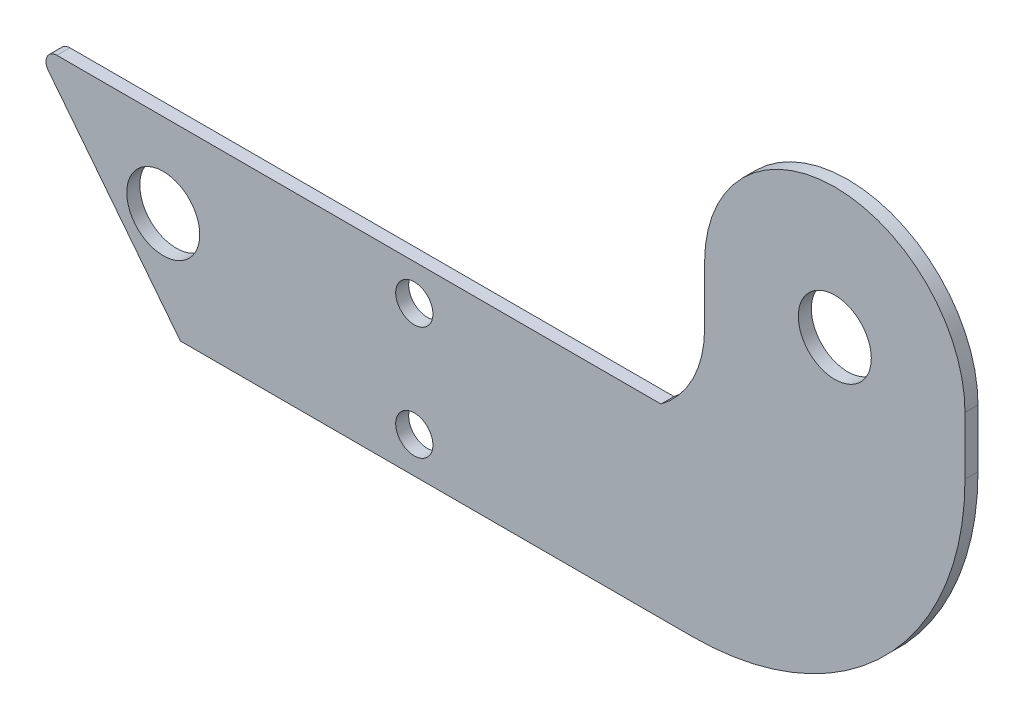
ISO-10303-21;
HEADER;
FILE_DESCRIPTION(('STEP AP214'),'2;1');
FILE_NAME('part.step','',(''),(''),'','','');
FILE_SCHEMA(('AUTOMOTIVE_DESIGN { 1 0 10303 214 1 1 1 1 }'));
ENDSEC;
DATA;
#1=APPLICATION_CONTEXT('core data for automotive mechanical design processes');
#2=APPLICATION_PROTOCOL_DEFINITION('international standard','automotive_design',2000,#1);
#3=PRODUCT_CONTEXT('',#1,'mechanical');
#4=PRODUCT('Part','Part','',(#3));
#5=PRODUCT_RELATED_PRODUCT_CATEGORY('part','',(#4));
#6=PRODUCT_DEFINITION_FORMATION('','',#4);
#7=PRODUCT_DEFINITION_CONTEXT('part definition',#1,'design');
#8=PRODUCT_DEFINITION('design','',#6,#7);
#9=PRODUCT_DEFINITION_SHAPE('','',#8);
#10=(LENGTH_UNIT() NAMED_UNIT(*) SI_UNIT(.MILLI.,.METRE.));
#11=(NAMED_UNIT(*) PLANE_ANGLE_UNIT() SI_UNIT($,.RADIAN.));
#12=(NAMED_UNIT(*) SI_UNIT($,.STERADIAN.) SOLID_ANGLE_UNIT());
#13=UNCERTAINTY_MEASURE_WITH_UNIT(LENGTH_MEASURE(1.E-05),#10,'distance_accuracy_value','');
#14=(GEOMETRIC_REPRESENTATION_CONTEXT(3) GLOBAL_UNCERTAINTY_ASSIGNED_CONTEXT((#13)) GLOBAL_UNIT_ASSIGNED_CONTEXT((#10,
#11,#12)) REPRESENTATION_CONTEXT('',''));
#15=CARTESIAN_POINT('',(0.,0.,0.));
#16=DIRECTION('',(0.,0.,1.));
#17=DIRECTION('',(1.,0.,0.));
#18=AXIS2_PLACEMENT_3D('',#15,#16,#17);
#19=CARTESIAN_POINT('',(0.,0.,1.8));
#20=DIRECTION('',(0.,0.,1.));
#21=DIRECTION('',(1.,0.,0.));
#22=AXIS2_PLACEMENT_3D('',#19,#20,#21);
#23=PLANE('',#22);
#24=CARTESIAN_POINT('',(-58.1953348882656,-25.0276954441722,1.8));
#25=DIRECTION('',(0.,0.,1.));
#26=DIRECTION('',(1.,0.,0.));
#27=AXIS2_PLACEMENT_3D('',#24,#25,#26);
#28=CIRCLE('',#27,2.57408060153384);
#29=CARTESIAN_POINT('',(-55.6212542867317,-25.0276954441722,1.8));
#30=VERTEX_POINT('',#29);
#31=EDGE_CURVE('E220',#30,#30,#28,.T.);
#32=ORIENTED_EDGE('',*,*,#31,.F.);
#33=EDGE_LOOP('',(#32));
#34=FACE_BOUND('',#33,.T.);
#35=CARTESIAN_POINT('',(0.,0.,1.8));
#36=DIRECTION('',(0.,0.,1.));
#37=DIRECTION('',(1.,0.,0.));
#38=AXIS2_PLACEMENT_3D('',#35,#36,#37);
#39=CIRCLE('',#38,5.05);
#40=CARTESIAN_POINT('',(5.05,0.,1.8));
#41=VERTEX_POINT('',#40);
#42=EDGE_CURVE('E191',#41,#41,#39,.T.);
#43=ORIENTED_EDGE('',*,*,#42,.F.);
#44=EDGE_LOOP('',(#43));
#45=FACE_BOUND('',#44,.T.);
#46=DIRECTION('',(-1.,0.,0.));
#47=VECTOR('',#46,1.);
#48=CARTESIAN_POINT('',(-24.0556103281021,-20.0276954441722,1.8));
#49=LINE('',#48,#47);
#50=CARTESIAN_POINT('',(-24.0556103281021,-20.0276954441722,1.8));
#51=VERTEX_POINT('',#50);
#52=CARTESIAN_POINT('',(-107.666374094776,-20.0276954441722,1.8));
#53=VERTEX_POINT('',#52);
#54=EDGE_CURVE('E203',#51,#53,#49,.T.);
#55=ORIENTED_EDGE('',*,*,#54,.T.);
#56=CARTESIAN_POINT('',(-107.666374094776,-21.5276954441722,1.8));
#57=DIRECTION('',(0.,0.,1.));
#58=DIRECTION('',(1.,0.,0.));
#59=AXIS2_PLACEMENT_3D('',#56,#57,#58);
#60=CIRCLE('',#59,1.5);
#61=CARTESIAN_POINT('',(-108.846127301271,-22.4540767758951,1.8));
#62=VERTEX_POINT('',#61);
#63=EDGE_CURVE('E11',#53,#62,#60,.T.);
#64=ORIENTED_EDGE('',*,*,#63,.T.);
#65=DIRECTION('',(0.617587554481916,-0.786502137663367,0.));
#66=VECTOR('',#65,1.);
#67=CARTESIAN_POINT('',(-110.751402368102,-20.0276954441722,1.8));
#68=LINE('',#67,#66);
#69=CARTESIAN_POINT('',(-90.5665985578281,-45.7331864792268,1.8));
#70=VERTEX_POINT('',#69);
#71=EDGE_CURVE('E200',#62,#70,#68,.T.);
#72=ORIENTED_EDGE('',*,*,#71,.T.);
#73=DIRECTION('',(1.,0.,0.));
#74=VECTOR('',#73,1.);
#75=CARTESIAN_POINT('',(-19.7146222684898,-45.7331864792268,1.8));
#76=LINE('',#75,#74);
#77=CARTESIAN_POINT('',(-19.7146222684898,-45.7331864792268,1.8));
#78=VERTEX_POINT('',#77);
#79=EDGE_CURVE('E197',#70,#78,#76,.T.);
#80=ORIENTED_EDGE('',*,*,#79,.T.);
#81=CARTESIAN_POINT('',(-19.7146222684898,-8.,1.8));
#82=DIRECTION('',(0.,0.,1.));
#83=DIRECTION('',(-1.,0.,0.));
#84=AXIS2_PLACEMENT_3D('',#81,#82,#83);
#85=CIRCLE('',#84,37.7331864792268);
#86=CARTESIAN_POINT('',(18.018564210737,-8.,1.8));
#87=VERTEX_POINT('',#86);
#88=EDGE_CURVE('E194',#78,#87,#85,.T.);
#89=ORIENTED_EDGE('',*,*,#88,.T.);
#90=DIRECTION('',(0.,1.,0.));
#91=VECTOR('',#90,1.);
#92=CARTESIAN_POINT('',(18.018564210737,0.,1.8));
#93=LINE('',#92,#91);
#94=CARTESIAN_POINT('',(18.018564210737,0.,1.8));
#95=VERTEX_POINT('',#94);
#96=EDGE_CURVE('E128',#87,#95,#93,.T.);
#97=ORIENTED_EDGE('',*,*,#96,.T.);
#98=CARTESIAN_POINT('',(0.,0.,1.8));
#99=DIRECTION('',(0.,0.,1.));
#100=DIRECTION('',(1.,0.,0.));
#101=AXIS2_PLACEMENT_3D('',#98,#99,#100);
#102=CIRCLE('',#101,18.018564210737);
#103=CARTESIAN_POINT('',(-18.018564210737,0.,1.8));
#104=VERTEX_POINT('',#103);
#105=EDGE_CURVE('E123',#95,#104,#102,.T.);
#106=ORIENTED_EDGE('',*,*,#105,.T.);
#107=DIRECTION('',(0.,-1.,0.));
#108=VECTOR('',#107,1.);
#109=CARTESIAN_POINT('',(-18.018564210737,0.,1.8));
#110=LINE('',#109,#108);
#111=CARTESIAN_POINT('',(-18.018564210737,-8.,1.8));
#112=VERTEX_POINT('',#111);
#113=EDGE_CURVE('E111',#104,#112,#110,.T.);
#114=ORIENTED_EDGE('',*,*,#113,.T.);
#115=CARTESIAN_POINT('',(-33.018564210737,-8.,1.8));
#116=DIRECTION('',(0.,0.,-1.));
#117=DIRECTION('',(-1.,0.,0.));
#118=AXIS2_PLACEMENT_3D('',#115,#116,#117);
#119=CIRCLE('',#118,15.);
#120=EDGE_CURVE('E122',#112,#51,#119,.T.);
#121=ORIENTED_EDGE('',*,*,#120,.T.);
#122=EDGE_LOOP('',(#55,#64,#72,#80,#89,#97,#106,#114,#121));
#123=FACE_BOUND('',#122,.T.);
#124=CARTESIAN_POINT('',(-58.1953348882656,-40.7331864792268,1.8));
#125=DIRECTION('',(0.,0.,1.));
#126=DIRECTION('',(1.,0.,0.));
#127=AXIS2_PLACEMENT_3D('',#124,#125,#126);
#128=CIRCLE('',#127,2.57408060153384);
#129=CARTESIAN_POINT('',(-55.6212542867317,-40.7331864792268,1.8));
#130=VERTEX_POINT('',#129);
#131=EDGE_CURVE('E212',#130,#130,#128,.T.);
#132=ORIENTED_EDGE('',*,*,#131,.F.);
#133=EDGE_LOOP('',(#132));
#134=FACE_BOUND('',#133,.T.);
#135=CARTESIAN_POINT('',(-92.9380100507997,-31.6399946487743,1.8));
#136=DIRECTION('',(0.,0.,1.));
#137=DIRECTION('',(1.,0.,0.));
#138=AXIS2_PLACEMENT_3D('',#135,#136,#137);
#139=CIRCLE('',#138,5.05);
#140=CARTESIAN_POINT('',(-87.8880100507997,-31.6399946487743,1.8));
#141=VERTEX_POINT('',#140);
#142=EDGE_CURVE('E228',#141,#141,#139,.T.);
#143=ORIENTED_EDGE('',*,*,#142,.F.);
#144=EDGE_LOOP('',(#143));
#145=FACE_BOUND('',#144,.T.);
#146=ADVANCED_FACE('F39',(#34,#45,#123,#134,#145),#23,.T.);
#147=CARTESIAN_POINT('',(0.,0.,0.));
#148=DIRECTION('',(0.,0.,1.));
#149=DIRECTION('',(1.,0.,0.));
#150=AXIS2_PLACEMENT_3D('',#147,#148,#149);
#151=PLANE('',#150);
#152=DIRECTION('',(0.617587554481916,-0.786502137663367,0.));
#153=VECTOR('',#152,1.);
#154=CARTESIAN_POINT('',(-110.751402368102,-20.0276954441722,0.));
#155=LINE('',#154,#153);
#156=CARTESIAN_POINT('',(-108.846127301271,-22.4540767758951,0.));
#157=VERTEX_POINT('',#156);
#158=CARTESIAN_POINT('',(-90.5665985578281,-45.7331864792268,0.));
#159=VERTEX_POINT('',#158);
#160=EDGE_CURVE('E177',#157,#159,#155,.T.);
#161=ORIENTED_EDGE('',*,*,#160,.F.);
#162=CARTESIAN_POINT('',(-107.666374094776,-21.5276954441722,0.));
#163=DIRECTION('',(0.,0.,1.));
#164=DIRECTION('',(1.,0.,0.));
#165=AXIS2_PLACEMENT_3D('',#162,#163,#164);
#166=CIRCLE('',#165,1.5);
#167=CARTESIAN_POINT('',(-107.666374094776,-20.0276954441722,0.));
#168=VERTEX_POINT('',#167);
#169=EDGE_CURVE('E62',#157,#168,#166,.F.);
#170=ORIENTED_EDGE('',*,*,#169,.T.);
#171=DIRECTION('',(-1.,0.,0.));
#172=VECTOR('',#171,1.);
#173=CARTESIAN_POINT('',(-24.0556103281021,-20.0276954441722,0.));
#174=LINE('',#173,#172);
#175=CARTESIAN_POINT('',(-24.0556103281021,-20.0276954441722,0.));
#176=VERTEX_POINT('',#175);
#177=EDGE_CURVE('E180',#176,#168,#174,.T.);
#178=ORIENTED_EDGE('',*,*,#177,.F.);
#179=CARTESIAN_POINT('',(-33.018564210737,-8.,0.));
#180=DIRECTION('',(0.,0.,-1.));
#181=DIRECTION('',(-1.,0.,0.));
#182=AXIS2_PLACEMENT_3D('',#179,#180,#181);
#183=CIRCLE('',#182,15.);
#184=CARTESIAN_POINT('',(-18.018564210737,-8.,0.));
#185=VERTEX_POINT('',#184);
#186=EDGE_CURVE('E183',#185,#176,#183,.T.);
#187=ORIENTED_EDGE('',*,*,#186,.F.);
#188=DIRECTION('',(0.,-1.,0.));
#189=VECTOR('',#188,1.);
#190=CARTESIAN_POINT('',(-18.018564210737,0.,0.));
#191=LINE('',#190,#189);
#192=CARTESIAN_POINT('',(-18.018564210737,0.,0.));
#193=VERTEX_POINT('',#192);
#194=EDGE_CURVE('E186',#193,#185,#191,.T.);
#195=ORIENTED_EDGE('',*,*,#194,.F.);
#196=CARTESIAN_POINT('',(0.,0.,0.));
#197=DIRECTION('',(0.,0.,1.));
#198=DIRECTION('',(1.,0.,0.));
#199=AXIS2_PLACEMENT_3D('',#196,#197,#198);
#200=CIRCLE('',#199,18.018564210737);
#201=CARTESIAN_POINT('',(18.018564210737,0.,0.));
#202=VERTEX_POINT('',#201);
#203=EDGE_CURVE('E137',#202,#193,#200,.T.);
#204=ORIENTED_EDGE('',*,*,#203,.F.);
#205=DIRECTION('',(0.,1.,0.));
#206=VECTOR('',#205,1.);
#207=CARTESIAN_POINT('',(18.018564210737,0.,0.));
#208=LINE('',#207,#206);
#209=CARTESIAN_POINT('',(18.018564210737,-8.,0.));
#210=VERTEX_POINT('',#209);
#211=EDGE_CURVE('E133',#210,#202,#208,.T.);
#212=ORIENTED_EDGE('',*,*,#211,.F.);
#213=CARTESIAN_POINT('',(-19.7146222684898,-8.,0.));
#214=DIRECTION('',(0.,0.,1.));
#215=DIRECTION('',(-1.,0.,0.));
#216=AXIS2_PLACEMENT_3D('',#213,#214,#215);
#217=CIRCLE('',#216,37.7331864792268);
#218=CARTESIAN_POINT('',(-19.7146222684898,-45.7331864792268,0.));
#219=VERTEX_POINT('',#218);
#220=EDGE_CURVE('E171',#219,#210,#217,.T.);
#221=ORIENTED_EDGE('',*,*,#220,.F.);
#222=DIRECTION('',(1.,0.,0.));
#223=VECTOR('',#222,1.);
#224=CARTESIAN_POINT('',(-19.7146222684898,-45.7331864792268,0.));
#225=LINE('',#224,#223);
#226=EDGE_CURVE('E174',#159,#219,#225,.T.);
#227=ORIENTED_EDGE('',*,*,#226,.F.);
#228=EDGE_LOOP('',(#161,#170,#178,#187,#195,#204,#212,#221,#227));
#229=FACE_BOUND('',#228,.T.);
#230=CARTESIAN_POINT('',(0.,0.,0.));
#231=DIRECTION('',(0.,0.,1.));
#232=DIRECTION('',(1.,0.,0.));
#233=AXIS2_PLACEMENT_3D('',#230,#231,#232);
#234=CIRCLE('',#233,5.05);
#235=CARTESIAN_POINT('',(5.05,0.,0.));
#236=VERTEX_POINT('',#235);
#237=EDGE_CURVE('E208',#236,#236,#234,.T.);
#238=ORIENTED_EDGE('',*,*,#237,.T.);
#239=EDGE_LOOP('',(#238));
#240=FACE_BOUND('',#239,.T.);
#241=CARTESIAN_POINT('',(-58.1953348882656,-40.7331864792268,0.));
#242=DIRECTION('',(0.,0.,1.));
#243=DIRECTION('',(1.,0.,0.));
#244=AXIS2_PLACEMENT_3D('',#241,#242,#243);
#245=CIRCLE('',#244,2.57408060153384);
#246=CARTESIAN_POINT('',(-55.6212542867317,-40.7331864792268,0.));
#247=VERTEX_POINT('',#246);
#248=EDGE_CURVE('E216',#247,#247,#245,.T.);
#249=ORIENTED_EDGE('',*,*,#248,.T.);
#250=EDGE_LOOP('',(#249));
#251=FACE_BOUND('',#250,.T.);
#252=CARTESIAN_POINT('',(-58.1953348882656,-25.0276954441722,0.));
#253=DIRECTION('',(0.,0.,1.));
#254=DIRECTION('',(1.,0.,0.));
#255=AXIS2_PLACEMENT_3D('',#252,#253,#254);
#256=CIRCLE('',#255,2.57408060153384);
#257=CARTESIAN_POINT('',(-55.6212542867317,-25.0276954441722,0.));
#258=VERTEX_POINT('',#257);
#259=EDGE_CURVE('E224',#258,#258,#256,.T.);
#260=ORIENTED_EDGE('',*,*,#259,.T.);
#261=EDGE_LOOP('',(#260));
#262=FACE_BOUND('',#261,.T.);
#263=CARTESIAN_POINT('',(-92.9380100507997,-31.6399946487743,0.));
#264=DIRECTION('',(0.,0.,1.));
#265=DIRECTION('',(1.,0.,0.));
#266=AXIS2_PLACEMENT_3D('',#263,#264,#265);
#267=CIRCLE('',#266,5.05);
#268=CARTESIAN_POINT('',(-87.8880100507997,-31.6399946487743,0.));
#269=VERTEX_POINT('',#268);
#270=EDGE_CURVE('E232',#269,#269,#267,.T.);
#271=ORIENTED_EDGE('',*,*,#270,.T.);
#272=EDGE_LOOP('',(#271));
#273=FACE_BOUND('',#272,.T.);
#274=ADVANCED_FACE('F244',(#229,#240,#251,#262,#273),#151,.F.);
#275=CARTESIAN_POINT('',(0.,0.,1.8));
#276=DIRECTION('',(0.,0.,-1.));
#277=DIRECTION('',(-1.,0.,0.));
#278=AXIS2_PLACEMENT_3D('',#275,#276,#277);
#279=CYLINDRICAL_SURFACE('',#278,18.018564210737);
#280=ORIENTED_EDGE('',*,*,#203,.T.);
#281=DIRECTION('',(0.,0.,-1.));
#282=VECTOR('',#281,1.);
#283=CARTESIAN_POINT('',(-18.018564210737,0.,1.8));
#284=LINE('',#283,#282);
#285=EDGE_CURVE('E115',#104,#193,#284,.T.);
#286=ORIENTED_EDGE('',*,*,#285,.F.);
#287=ORIENTED_EDGE('',*,*,#105,.F.);
#288=DIRECTION('',(0.,0.,-1.));
#289=VECTOR('',#288,1.);
#290=CARTESIAN_POINT('',(18.018564210737,0.,1.8));
#291=LINE('',#290,#289);
#292=EDGE_CURVE('E166',#95,#202,#291,.T.);
#293=ORIENTED_EDGE('',*,*,#292,.T.);
#294=EDGE_LOOP('',(#280,#286,#287,#293));
#295=FACE_BOUND('',#294,.T.);
#296=ADVANCED_FACE('F135',(#295),#279,.T.);
#297=CARTESIAN_POINT('',(-18.018564210737,0.,1.8));
#298=DIRECTION('',(1.,0.,0.));
#299=DIRECTION('',(0.,1.,0.));
#300=AXIS2_PLACEMENT_3D('',#297,#298,#299);
#301=PLANE('',#300);
#302=ORIENTED_EDGE('',*,*,#194,.T.);
#303=DIRECTION('',(0.,0.,-1.));
#304=VECTOR('',#303,1.);
#305=CARTESIAN_POINT('',(-18.018564210737,-8.,1.8));
#306=LINE('',#305,#304);
#307=EDGE_CURVE('E118',#112,#185,#306,.T.);
#308=ORIENTED_EDGE('',*,*,#307,.F.);
#309=ORIENTED_EDGE('',*,*,#113,.F.);
#310=ORIENTED_EDGE('',*,*,#285,.T.);
#311=EDGE_LOOP('',(#302,#308,#309,#310));
#312=FACE_BOUND('',#311,.T.);
#313=ADVANCED_FACE('F113',(#312),#301,.F.);
#314=CARTESIAN_POINT('',(-33.018564210737,-8.,1.8));
#315=DIRECTION('',(0.,0.,-1.));
#316=DIRECTION('',(-1.,0.,0.));
#317=AXIS2_PLACEMENT_3D('',#314,#315,#316);
#318=CYLINDRICAL_SURFACE('',#317,15.);
#319=ORIENTED_EDGE('',*,*,#186,.T.);
#320=DIRECTION('',(0.,0.,-1.));
#321=VECTOR('',#320,1.);
#322=CARTESIAN_POINT('',(-24.0556103281021,-20.0276954441722,1.8));
#323=LINE('',#322,#321);
#324=EDGE_CURVE('E145',#51,#176,#323,.T.);
#325=ORIENTED_EDGE('',*,*,#324,.F.);
#326=ORIENTED_EDGE('',*,*,#120,.F.);
#327=ORIENTED_EDGE('',*,*,#307,.T.);
#328=EDGE_LOOP('',(#319,#325,#326,#327));
#329=FACE_BOUND('',#328,.T.);
#330=ADVANCED_FACE('F276',(#329),#318,.F.);
#331=CARTESIAN_POINT('',(-24.0556103281021,-20.0276954441722,1.8));
#332=DIRECTION('',(0.,-1.,0.));
#333=DIRECTION('',(1.,0.,0.));
#334=AXIS2_PLACEMENT_3D('',#331,#332,#333);
#335=PLANE('',#334);
#336=ORIENTED_EDGE('',*,*,#177,.T.);
#337=DIRECTION('',(0.,0.,-1.));
#338=VECTOR('',#337,1.);
#339=CARTESIAN_POINT('',(-107.666374094776,-20.0276954441722,1.8));
#340=LINE('',#339,#338);
#341=EDGE_CURVE('E48',#168,#53,#340,.F.);
#342=ORIENTED_EDGE('',*,*,#341,.T.);
#343=ORIENTED_EDGE('',*,*,#54,.F.);
#344=ORIENTED_EDGE('',*,*,#324,.T.);
#345=EDGE_LOOP('',(#336,#342,#343,#344));
#346=FACE_BOUND('',#345,.T.);
#347=ADVANCED_FACE('F272',(#346),#335,.F.);
#348=CARTESIAN_POINT('',(-110.751402368102,-20.0276954441722,1.8));
#349=DIRECTION('',(0.786502137663367,0.617587554481916,0.));
#350=DIRECTION('',(-0.617587554481916,0.786502137663367,0.));
#351=AXIS2_PLACEMENT_3D('',#348,#349,#350);
#352=PLANE('',#351);
#353=ORIENTED_EDGE('',*,*,#71,.F.);
#354=DIRECTION('',(0.,0.,-1.));
#355=VECTOR('',#354,1.);
#356=CARTESIAN_POINT('',(-108.846127301271,-22.4540767758951,1.8));
#357=LINE('',#356,#355);
#358=EDGE_CURVE('E139',#62,#157,#357,.T.);
#359=ORIENTED_EDGE('',*,*,#358,.T.);
#360=ORIENTED_EDGE('',*,*,#160,.T.);
#361=DIRECTION('',(0.,0.,-1.));
#362=VECTOR('',#361,1.);
#363=CARTESIAN_POINT('',(-90.5665985578281,-45.7331864792268,1.8));
#364=LINE('',#363,#362);
#365=EDGE_CURVE('E154',#70,#159,#364,.T.);
#366=ORIENTED_EDGE('',*,*,#365,.F.);
#367=EDGE_LOOP('',(#353,#359,#360,#366));
#368=FACE_BOUND('',#367,.T.);
#369=ADVANCED_FACE('F268',(#368),#352,.F.);
#370=CARTESIAN_POINT('',(-19.7146222684898,-45.7331864792268,1.8));
#371=DIRECTION('',(0.,1.,0.));
#372=DIRECTION('',(-1.,0.,0.));
#373=AXIS2_PLACEMENT_3D('',#370,#371,#372);
#374=PLANE('',#373);
#375=ORIENTED_EDGE('',*,*,#226,.T.);
#376=DIRECTION('',(0.,0.,-1.));
#377=VECTOR('',#376,1.);
#378=CARTESIAN_POINT('',(-19.7146222684898,-45.7331864792268,1.8));
#379=LINE('',#378,#377);
#380=EDGE_CURVE('E158',#78,#219,#379,.T.);
#381=ORIENTED_EDGE('',*,*,#380,.F.);
#382=ORIENTED_EDGE('',*,*,#79,.F.);
#383=ORIENTED_EDGE('',*,*,#365,.T.);
#384=EDGE_LOOP('',(#375,#381,#382,#383));
#385=FACE_BOUND('',#384,.T.);
#386=ADVANCED_FACE('F264',(#385),#374,.F.);
#387=CARTESIAN_POINT('',(-19.7146222684898,-8.,1.8));
#388=DIRECTION('',(0.,0.,-1.));
#389=DIRECTION('',(-1.,0.,0.));
#390=AXIS2_PLACEMENT_3D('',#387,#388,#389);
#391=CYLINDRICAL_SURFACE('',#390,37.7331864792268);
#392=ORIENTED_EDGE('',*,*,#220,.T.);
#393=DIRECTION('',(0.,0.,-1.));
#394=VECTOR('',#393,1.);
#395=CARTESIAN_POINT('',(18.018564210737,-8.,1.8));
#396=LINE('',#395,#394);
#397=EDGE_CURVE('E162',#87,#210,#396,.T.);
#398=ORIENTED_EDGE('',*,*,#397,.F.);
#399=ORIENTED_EDGE('',*,*,#88,.F.);
#400=ORIENTED_EDGE('',*,*,#380,.T.);
#401=EDGE_LOOP('',(#392,#398,#399,#400));
#402=FACE_BOUND('',#401,.T.);
#403=ADVANCED_FACE('F260',(#402),#391,.T.);
#404=CARTESIAN_POINT('',(18.018564210737,0.,1.8));
#405=DIRECTION('',(-1.,0.,0.));
#406=DIRECTION('',(0.,0.,1.));
#407=AXIS2_PLACEMENT_3D('',#404,#405,#406);
#408=PLANE('',#407);
#409=ORIENTED_EDGE('',*,*,#211,.T.);
#410=ORIENTED_EDGE('',*,*,#292,.F.);
#411=ORIENTED_EDGE('',*,*,#96,.F.);
#412=ORIENTED_EDGE('',*,*,#397,.T.);
#413=EDGE_LOOP('',(#409,#410,#411,#412));
#414=FACE_BOUND('',#413,.T.);
#415=ADVANCED_FACE('F257',(#414),#408,.F.);
#416=CARTESIAN_POINT('',(0.,0.,1.8));
#417=DIRECTION('',(0.,0.,-1.));
#418=DIRECTION('',(-1.,0.,0.));
#419=AXIS2_PLACEMENT_3D('',#416,#417,#418);
#420=CYLINDRICAL_SURFACE('',#419,5.05);
#421=ORIENTED_EDGE('',*,*,#42,.T.);
#422=EDGE_LOOP('',(#421));
#423=FACE_BOUND('',#422,.T.);
#424=ORIENTED_EDGE('',*,*,#237,.F.);
#425=EDGE_LOOP('',(#424));
#426=FACE_BOUND('',#425,.T.);
#427=ADVANCED_FACE('F254',(#423,#426),#420,.F.);
#428=CARTESIAN_POINT('',(-58.1953348882656,-40.7331864792268,1.8));
#429=DIRECTION('',(0.,0.,-1.));
#430=DIRECTION('',(-1.,0.,0.));
#431=AXIS2_PLACEMENT_3D('',#428,#429,#430);
#432=CYLINDRICAL_SURFACE('',#431,2.57408060153384);
#433=ORIENTED_EDGE('',*,*,#131,.T.);
#434=EDGE_LOOP('',(#433));
#435=FACE_BOUND('',#434,.T.);
#436=ORIENTED_EDGE('',*,*,#248,.F.);
#437=EDGE_LOOP('',(#436));
#438=FACE_BOUND('',#437,.T.);
#439=ADVANCED_FACE('F321',(#435,#438),#432,.F.);
#440=CARTESIAN_POINT('',(-58.1953348882656,-25.0276954441722,1.8));
#441=DIRECTION('',(0.,0.,-1.));
#442=DIRECTION('',(-1.,0.,0.));
#443=AXIS2_PLACEMENT_3D('',#440,#441,#442);
#444=CYLINDRICAL_SURFACE('',#443,2.57408060153384);
#445=ORIENTED_EDGE('',*,*,#31,.T.);
#446=EDGE_LOOP('',(#445));
#447=FACE_BOUND('',#446,.T.);
#448=ORIENTED_EDGE('',*,*,#259,.F.);
#449=EDGE_LOOP('',(#448));
#450=FACE_BOUND('',#449,.T.);
#451=ADVANCED_FACE('F328',(#447,#450),#444,.F.);
#452=CARTESIAN_POINT('',(-92.9380100507997,-31.6399946487743,1.8));
#453=DIRECTION('',(0.,0.,-1.));
#454=DIRECTION('',(-1.,0.,0.));
#455=AXIS2_PLACEMENT_3D('',#452,#453,#454);
#456=CYLINDRICAL_SURFACE('',#455,5.05);
#457=ORIENTED_EDGE('',*,*,#142,.T.);
#458=EDGE_LOOP('',(#457));
#459=FACE_BOUND('',#458,.T.);
#460=ORIENTED_EDGE('',*,*,#270,.F.);
#461=EDGE_LOOP('',(#460));
#462=FACE_BOUND('',#461,.T.);
#463=ADVANCED_FACE('F240',(#459,#462),#456,.F.);
#464=CARTESIAN_POINT('',(-107.666374094776,-21.5276954441722,1.8));
#465=DIRECTION('',(0.,0.,-1.));
#466=DIRECTION('',(-1.,0.,0.));
#467=AXIS2_PLACEMENT_3D('',#464,#465,#466);
#468=CYLINDRICAL_SURFACE('',#467,1.5);
#469=ORIENTED_EDGE('',*,*,#63,.F.);
#470=ORIENTED_EDGE('',*,*,#341,.F.);
#471=ORIENTED_EDGE('',*,*,#169,.F.);
#472=ORIENTED_EDGE('',*,*,#358,.F.);
#473=EDGE_LOOP('',(#469,#470,#471,#472));
#474=FACE_BOUND('',#473,.T.);
#475=ADVANCED_FACE('F41',(#474),#468,.T.);
#476=CLOSED_SHELL('',(#146,#274,#296,#313,#330,#347,#369,#386,#403,#415,#427,#439,#451,#463,#475));
#477=MANIFOLD_SOLID_BREP('B2',#476);
#478=ADVANCED_BREP_SHAPE_REPRESENTATION('',(#18,#477),#14);
#479=SHAPE_DEFINITION_REPRESENTATION(#9,#478);
ENDSEC;
END-ISO-10303-21;
